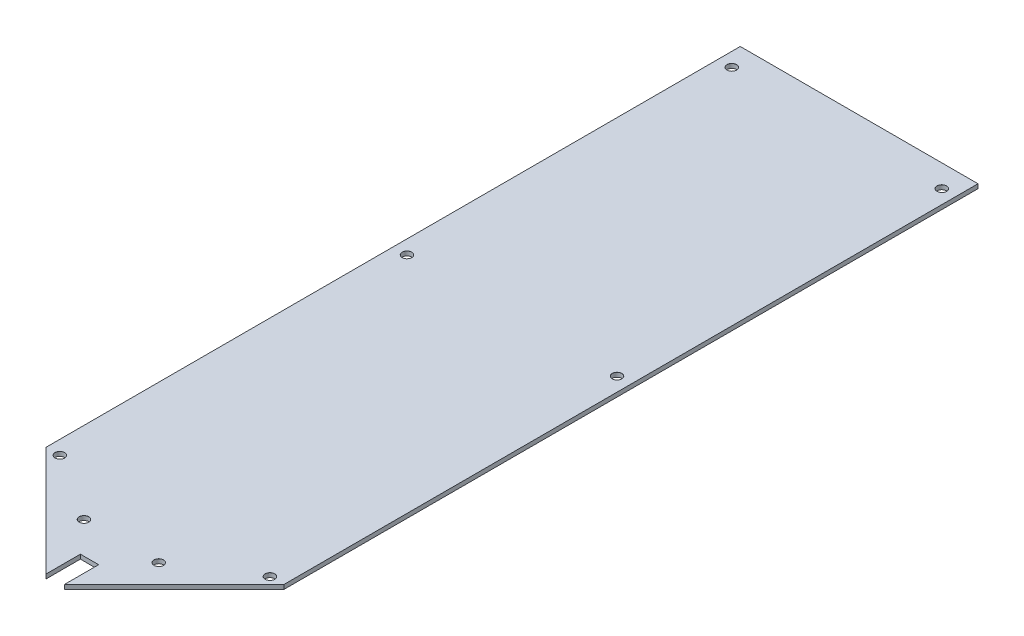
ISO-10303-21;
HEADER;
FILE_DESCRIPTION(('STEP AP214'),'2;1');
FILE_NAME('part.step','',(''),(''),'','','');
FILE_SCHEMA(('AUTOMOTIVE_DESIGN { 1 0 10303 214 1 1 1 1 }'));
ENDSEC;
DATA;
#1=APPLICATION_CONTEXT('core data for automotive mechanical design processes');
#2=APPLICATION_PROTOCOL_DEFINITION('international standard','automotive_design',2000,#1);
#3=PRODUCT_CONTEXT('',#1,'mechanical');
#4=PRODUCT('Part','Part','',(#3));
#5=PRODUCT_RELATED_PRODUCT_CATEGORY('part','',(#4));
#6=PRODUCT_DEFINITION_FORMATION('','',#4);
#7=PRODUCT_DEFINITION_CONTEXT('part definition',#1,'design');
#8=PRODUCT_DEFINITION('design','',#6,#7);
#9=PRODUCT_DEFINITION_SHAPE('','',#8);
#10=(LENGTH_UNIT() NAMED_UNIT(*) SI_UNIT(.MILLI.,.METRE.));
#11=(NAMED_UNIT(*) PLANE_ANGLE_UNIT() SI_UNIT($,.RADIAN.));
#12=(NAMED_UNIT(*) SI_UNIT($,.STERADIAN.) SOLID_ANGLE_UNIT());
#13=UNCERTAINTY_MEASURE_WITH_UNIT(LENGTH_MEASURE(1.E-05),#10,'distance_accuracy_value','');
#14=(GEOMETRIC_REPRESENTATION_CONTEXT(3) GLOBAL_UNCERTAINTY_ASSIGNED_CONTEXT((#13)) GLOBAL_UNIT_ASSIGNED_CONTEXT((#10,
#11,#12)) REPRESENTATION_CONTEXT('',''));
#15=CARTESIAN_POINT('',(0.,0.,0.));
#16=DIRECTION('',(0.,0.,1.));
#17=DIRECTION('',(1.,0.,0.));
#18=AXIS2_PLACEMENT_3D('',#15,#16,#17);
#19=CARTESIAN_POINT('',(82.7,-3.,-82.7000000000012));
#20=DIRECTION('',(1.,0.,0.));
#21=DIRECTION('',(0.,0.,-1.));
#22=AXIS2_PLACEMENT_3D('',#19,#20,#21);
#23=PLANE('',#22);
#24=DIRECTION('',(0.,0.,-1.));
#25=VECTOR('',#24,1.);
#26=CARTESIAN_POINT('',(82.7,0.,-82.7000000000012));
#27=LINE('',#26,#25);
#28=CARTESIAN_POINT('',(82.7,0.,-82.7000000000012));
#29=VERTEX_POINT('',#28);
#30=CARTESIAN_POINT('',(82.7,0.,-565.66051224));
#31=VERTEX_POINT('',#30);
#32=EDGE_CURVE('E149',#29,#31,#27,.T.);
#33=ORIENTED_EDGE('',*,*,#32,.F.);
#34=DIRECTION('',(0.,1.,0.));
#35=VECTOR('',#34,1.);
#36=CARTESIAN_POINT('',(82.7,-3.,-82.7000000000012));
#37=LINE('',#36,#35);
#38=CARTESIAN_POINT('',(82.7,-3.,-82.7000000000012));
#39=VERTEX_POINT('',#38);
#40=EDGE_CURVE('E11',#39,#29,#37,.T.);
#41=ORIENTED_EDGE('',*,*,#40,.F.);
#42=DIRECTION('',(0.,0.,-1.));
#43=VECTOR('',#42,1.);
#44=CARTESIAN_POINT('',(82.7,-3.,-82.7000000000012));
#45=LINE('',#44,#43);
#46=CARTESIAN_POINT('',(82.7,-3.,-565.66051224));
#47=VERTEX_POINT('',#46);
#48=EDGE_CURVE('E178',#39,#47,#45,.T.);
#49=ORIENTED_EDGE('',*,*,#48,.T.);
#50=DIRECTION('',(0.,1.,0.));
#51=VECTOR('',#50,1.);
#52=CARTESIAN_POINT('',(82.7,-3.,-565.66051224));
#53=LINE('',#52,#51);
#54=EDGE_CURVE('E102',#47,#31,#53,.T.);
#55=ORIENTED_EDGE('',*,*,#54,.T.);
#56=EDGE_LOOP('',(#33,#41,#49,#55));
#57=FACE_BOUND('',#56,.T.);
#58=ADVANCED_FACE('F45',(#57),#23,.T.);
#59=CARTESIAN_POINT('',(6.35,-3.,-6.35000000000009));
#60=DIRECTION('',(0.707106781186553,0.,0.707106781186542));
#61=DIRECTION('',(0.707106781186542,0.,-0.707106781186553));
#62=AXIS2_PLACEMENT_3D('',#59,#60,#61);
#63=PLANE('',#62);
#64=DIRECTION('',(0.707106781186543,0.,-0.707106781186553));
#65=VECTOR('',#64,1.);
#66=CARTESIAN_POINT('',(6.35,0.,-6.35000000000009));
#67=LINE('',#66,#65);
#68=CARTESIAN_POINT('',(6.35,0.,-6.35000000000009));
#69=VERTEX_POINT('',#68);
#70=EDGE_CURVE('E175',#69,#29,#67,.T.);
#71=ORIENTED_EDGE('',*,*,#70,.F.);
#72=DIRECTION('',(0.,1.,0.));
#73=VECTOR('',#72,1.);
#74=CARTESIAN_POINT('',(6.35,-3.,-6.35000000000009));
#75=LINE('',#74,#73);
#76=CARTESIAN_POINT('',(6.35,-3.,-6.35000000000009));
#77=VERTEX_POINT('',#76);
#78=EDGE_CURVE('E55',#77,#69,#75,.T.);
#79=ORIENTED_EDGE('',*,*,#78,.F.);
#80=DIRECTION('',(0.707106781186543,0.,-0.707106781186553));
#81=VECTOR('',#80,1.);
#82=CARTESIAN_POINT('',(6.35,-3.,-6.35000000000009));
#83=LINE('',#82,#81);
#84=EDGE_CURVE('E135',#77,#39,#83,.T.);
#85=ORIENTED_EDGE('',*,*,#84,.T.);
#86=ORIENTED_EDGE('',*,*,#40,.T.);
#87=EDGE_LOOP('',(#71,#79,#85,#86));
#88=FACE_BOUND('',#87,.T.);
#89=ADVANCED_FACE('F304',(#88),#63,.T.);
#90=CARTESIAN_POINT('',(6.35,-3.,-30.27243444));
#91=DIRECTION('',(-1.,0.,0.));
#92=DIRECTION('',(0.,0.,1.));
#93=AXIS2_PLACEMENT_3D('',#90,#91,#92);
#94=PLANE('',#93);
#95=DIRECTION('',(0.,0.,1.));
#96=VECTOR('',#95,1.);
#97=CARTESIAN_POINT('',(6.35,0.,-30.27243444));
#98=LINE('',#97,#96);
#99=CARTESIAN_POINT('',(6.35,0.,-30.27243444));
#100=VERTEX_POINT('',#99);
#101=EDGE_CURVE('E121',#100,#69,#98,.T.);
#102=ORIENTED_EDGE('',*,*,#101,.F.);
#103=DIRECTION('',(0.,1.,0.));
#104=VECTOR('',#103,1.);
#105=CARTESIAN_POINT('',(6.35,-3.,-30.27243444));
#106=LINE('',#105,#104);
#107=CARTESIAN_POINT('',(6.35,-3.,-30.27243444));
#108=VERTEX_POINT('',#107);
#109=EDGE_CURVE('E116',#108,#100,#106,.T.);
#110=ORIENTED_EDGE('',*,*,#109,.F.);
#111=DIRECTION('',(0.,0.,1.));
#112=VECTOR('',#111,1.);
#113=CARTESIAN_POINT('',(6.35,-3.,-30.27243444));
#114=LINE('',#113,#112);
#115=EDGE_CURVE('E119',#108,#77,#114,.T.);
#116=ORIENTED_EDGE('',*,*,#115,.T.);
#117=ORIENTED_EDGE('',*,*,#78,.T.);
#118=EDGE_LOOP('',(#102,#110,#116,#117));
#119=FACE_BOUND('',#118,.T.);
#120=ADVANCED_FACE('F118',(#119),#94,.T.);
#121=CARTESIAN_POINT('',(-6.35000000000002,-3.,-30.27243444));
#122=DIRECTION('',(0.,0.,1.));
#123=DIRECTION('',(1.,0.,0.));
#124=AXIS2_PLACEMENT_3D('',#121,#122,#123);
#125=PLANE('',#124);
#126=DIRECTION('',(1.,0.,0.));
#127=VECTOR('',#126,1.);
#128=CARTESIAN_POINT('',(-6.35000000000002,0.,-30.27243444));
#129=LINE('',#128,#127);
#130=CARTESIAN_POINT('',(-6.35000000000002,0.,-30.27243444));
#131=VERTEX_POINT('',#130);
#132=EDGE_CURVE('E170',#131,#100,#129,.T.);
#133=ORIENTED_EDGE('',*,*,#132,.F.);
#134=DIRECTION('',(0.,1.,0.));
#135=VECTOR('',#134,1.);
#136=CARTESIAN_POINT('',(-6.35000000000002,-3.,-30.27243444));
#137=LINE('',#136,#135);
#138=CARTESIAN_POINT('',(-6.35000000000002,-3.,-30.27243444));
#139=VERTEX_POINT('',#138);
#140=EDGE_CURVE('E127',#139,#131,#137,.T.);
#141=ORIENTED_EDGE('',*,*,#140,.F.);
#142=DIRECTION('',(1.,0.,0.));
#143=VECTOR('',#142,1.);
#144=CARTESIAN_POINT('',(-6.35000000000002,-3.,-30.27243444));
#145=LINE('',#144,#143);
#146=EDGE_CURVE('E133',#139,#108,#145,.T.);
#147=ORIENTED_EDGE('',*,*,#146,.T.);
#148=ORIENTED_EDGE('',*,*,#109,.T.);
#149=EDGE_LOOP('',(#133,#141,#147,#148));
#150=FACE_BOUND('',#149,.T.);
#151=ADVANCED_FACE('F138',(#150),#125,.T.);
#152=CARTESIAN_POINT('',(-6.35000000000002,-3.,-30.27243444));
#153=DIRECTION('',(1.,0.,0.));
#154=DIRECTION('',(0.,0.,-1.));
#155=AXIS2_PLACEMENT_3D('',#152,#153,#154);
#156=PLANE('',#155);
#157=DIRECTION('',(0.,0.,-1.));
#158=VECTOR('',#157,1.);
#159=CARTESIAN_POINT('',(-6.35000000000002,0.,-30.27243444));
#160=LINE('',#159,#158);
#161=CARTESIAN_POINT('',(-6.35000000000001,0.,-6.35000000000009));
#162=VERTEX_POINT('',#161);
#163=EDGE_CURVE('E166',#162,#131,#160,.T.);
#164=ORIENTED_EDGE('',*,*,#163,.F.);
#165=DIRECTION('',(0.,1.,0.));
#166=VECTOR('',#165,1.);
#167=CARTESIAN_POINT('',(-6.35000000000001,-3.,-6.35000000000009));
#168=LINE('',#167,#166);
#169=CARTESIAN_POINT('',(-6.35000000000001,-3.,-6.35000000000009));
#170=VERTEX_POINT('',#169);
#171=EDGE_CURVE('E184',#170,#162,#168,.T.);
#172=ORIENTED_EDGE('',*,*,#171,.F.);
#173=DIRECTION('',(0.,0.,-1.));
#174=VECTOR('',#173,1.);
#175=CARTESIAN_POINT('',(-6.35000000000002,-3.,-30.27243444));
#176=LINE('',#175,#174);
#177=EDGE_CURVE('E140',#170,#139,#176,.T.);
#178=ORIENTED_EDGE('',*,*,#177,.T.);
#179=ORIENTED_EDGE('',*,*,#140,.T.);
#180=EDGE_LOOP('',(#164,#172,#178,#179));
#181=FACE_BOUND('',#180,.T.);
#182=ADVANCED_FACE('F317',(#181),#156,.T.);
#183=CARTESIAN_POINT('',(-6.35000000000001,-3.,-6.35000000000009));
#184=DIRECTION('',(-0.707106781186553,0.,0.707106781186542));
#185=DIRECTION('',(0.707106781186542,0.,0.707106781186553));
#186=AXIS2_PLACEMENT_3D('',#183,#184,#185);
#187=PLANE('',#186);
#188=DIRECTION('',(0.707106781186542,0.,0.707106781186553));
#189=VECTOR('',#188,1.);
#190=CARTESIAN_POINT('',(-6.35000000000001,0.,-6.35000000000009));
#191=LINE('',#190,#189);
#192=CARTESIAN_POINT('',(-82.7,0.,-82.7000000000012));
#193=VERTEX_POINT('',#192);
#194=EDGE_CURVE('E162',#193,#162,#191,.T.);
#195=ORIENTED_EDGE('',*,*,#194,.F.);
#196=DIRECTION('',(0.,1.,0.));
#197=VECTOR('',#196,1.);
#198=CARTESIAN_POINT('',(-82.7,-3.,-82.7000000000012));
#199=LINE('',#198,#197);
#200=CARTESIAN_POINT('',(-82.7,-3.,-82.7000000000012));
#201=VERTEX_POINT('',#200);
#202=EDGE_CURVE('E187',#201,#193,#199,.T.);
#203=ORIENTED_EDGE('',*,*,#202,.F.);
#204=DIRECTION('',(0.707106781186542,0.,0.707106781186553));
#205=VECTOR('',#204,1.);
#206=CARTESIAN_POINT('',(-6.35000000000001,-3.,-6.35000000000009));
#207=LINE('',#206,#205);
#208=EDGE_CURVE('E143',#201,#170,#207,.T.);
#209=ORIENTED_EDGE('',*,*,#208,.T.);
#210=ORIENTED_EDGE('',*,*,#171,.T.);
#211=EDGE_LOOP('',(#195,#203,#209,#210));
#212=FACE_BOUND('',#211,.T.);
#213=ADVANCED_FACE('F295',(#212),#187,.T.);
#214=CARTESIAN_POINT('',(-82.7,-3.,-82.7000000000012));
#215=DIRECTION('',(-1.,0.,0.));
#216=DIRECTION('',(0.,0.,1.));
#217=AXIS2_PLACEMENT_3D('',#214,#215,#216);
#218=PLANE('',#217);
#219=DIRECTION('',(0.,0.,1.));
#220=VECTOR('',#219,1.);
#221=CARTESIAN_POINT('',(-82.7,0.,-82.7000000000012));
#222=LINE('',#221,#220);
#223=CARTESIAN_POINT('',(-82.7,0.,-565.66051224));
#224=VERTEX_POINT('',#223);
#225=EDGE_CURVE('E158',#224,#193,#222,.T.);
#226=ORIENTED_EDGE('',*,*,#225,.F.);
#227=DIRECTION('',(0.,1.,0.));
#228=VECTOR('',#227,1.);
#229=CARTESIAN_POINT('',(-82.7,-3.,-565.66051224));
#230=LINE('',#229,#228);
#231=CARTESIAN_POINT('',(-82.7,-3.,-565.66051224));
#232=VERTEX_POINT('',#231);
#233=EDGE_CURVE('E190',#232,#224,#230,.T.);
#234=ORIENTED_EDGE('',*,*,#233,.F.);
#235=DIRECTION('',(0.,0.,1.));
#236=VECTOR('',#235,1.);
#237=CARTESIAN_POINT('',(-82.7,-3.,-82.7000000000012));
#238=LINE('',#237,#236);
#239=EDGE_CURVE('E287',#232,#201,#238,.T.);
#240=ORIENTED_EDGE('',*,*,#239,.T.);
#241=ORIENTED_EDGE('',*,*,#202,.T.);
#242=EDGE_LOOP('',(#226,#234,#240,#241));
#243=FACE_BOUND('',#242,.T.);
#244=ADVANCED_FACE('F300',(#243),#218,.T.);
#245=CARTESIAN_POINT('',(-82.7,-3.,-565.66051224));
#246=DIRECTION('',(0.,0.,-1.));
#247=DIRECTION('',(-1.,0.,0.));
#248=AXIS2_PLACEMENT_3D('',#245,#246,#247);
#249=PLANE('',#248);
#250=DIRECTION('',(-1.,0.,0.));
#251=VECTOR('',#250,1.);
#252=CARTESIAN_POINT('',(-82.7,0.,-565.66051224));
#253=LINE('',#252,#251);
#254=EDGE_CURVE('E153',#31,#224,#253,.T.);
#255=ORIENTED_EDGE('',*,*,#254,.F.);
#256=ORIENTED_EDGE('',*,*,#54,.F.);
#257=DIRECTION('',(-1.,0.,0.));
#258=VECTOR('',#257,1.);
#259=CARTESIAN_POINT('',(-82.7,-3.,-565.66051224));
#260=LINE('',#259,#258);
#261=EDGE_CURVE('E284',#47,#232,#260,.T.);
#262=ORIENTED_EDGE('',*,*,#261,.T.);
#263=ORIENTED_EDGE('',*,*,#233,.T.);
#264=EDGE_LOOP('',(#255,#256,#262,#263));
#265=FACE_BOUND('',#264,.T.);
#266=ADVANCED_FACE('F301',(#265),#249,.T.);
#267=CARTESIAN_POINT('',(0.,-3.,0.));
#268=DIRECTION('',(0.,-1.,0.));
#269=DIRECTION('',(0.,0.,-1.));
#270=AXIS2_PLACEMENT_3D('',#267,#268,#269);
#271=PLANE('',#270);
#272=CARTESIAN_POINT('',(-73.056682922361,-3.,-550.131268360368));
#273=DIRECTION('',(0.,-1.,0.));
#274=DIRECTION('',(0.,0.,-1.));
#275=AXIS2_PLACEMENT_3D('',#272,#273,#274);
#276=CIRCLE('',#275,3.3);
#277=CARTESIAN_POINT('',(-73.056682922361,-3.,-553.431268360368));
#278=VERTEX_POINT('',#277);
#279=EDGE_CURVE('E48',#278,#278,#276,.T.);
#280=ORIENTED_EDGE('',*,*,#279,.F.);
#281=EDGE_LOOP('',(#280));
#282=FACE_BOUND('',#281,.T.);
#283=CARTESIAN_POINT('',(73.056682922361,-3.,-550.131268360368));
#284=DIRECTION('',(0.,-1.,0.));
#285=DIRECTION('',(0.,0.,-1.));
#286=AXIS2_PLACEMENT_3D('',#283,#284,#285);
#287=CIRCLE('',#286,3.3);
#288=CARTESIAN_POINT('',(73.056682922361,-3.,-553.431268360368));
#289=VERTEX_POINT('',#288);
#290=EDGE_CURVE('E228',#289,#289,#287,.T.);
#291=ORIENTED_EDGE('',*,*,#290,.F.);
#292=EDGE_LOOP('',(#291));
#293=FACE_BOUND('',#292,.T.);
#294=CARTESIAN_POINT('',(-73.056682922361,-3.,-324.180256120001));
#295=DIRECTION('',(0.,-1.,0.));
#296=DIRECTION('',(0.,0.,-1.));
#297=AXIS2_PLACEMENT_3D('',#294,#295,#296);
#298=CIRCLE('',#297,3.3);
#299=CARTESIAN_POINT('',(-73.056682922361,-3.,-327.480256120001));
#300=VERTEX_POINT('',#299);
#301=EDGE_CURVE('E223',#300,#300,#298,.T.);
#302=ORIENTED_EDGE('',*,*,#301,.F.);
#303=EDGE_LOOP('',(#302));
#304=FACE_BOUND('',#303,.T.);
#305=CARTESIAN_POINT('',(73.0566829223611,-3.,-324.180256120001));
#306=DIRECTION('',(0.,-1.,0.));
#307=DIRECTION('',(0.,0.,-1.));
#308=AXIS2_PLACEMENT_3D('',#305,#306,#307);
#309=CIRCLE('',#308,3.3);
#310=CARTESIAN_POINT('',(73.0566829223611,-3.,-327.480256120001));
#311=VERTEX_POINT('',#310);
#312=EDGE_CURVE('E217',#311,#311,#309,.T.);
#313=ORIENTED_EDGE('',*,*,#312,.F.);
#314=EDGE_LOOP('',(#313));
#315=FACE_BOUND('',#314,.T.);
#316=CARTESIAN_POINT('',(73.0566829223611,-3.,-82.7000000000012));
#317=DIRECTION('',(0.,-1.,0.));
#318=DIRECTION('',(0.,0.,-1.));
#319=AXIS2_PLACEMENT_3D('',#316,#317,#318);
#320=CIRCLE('',#319,3.3);
#321=CARTESIAN_POINT('',(73.0566829223611,-3.,-86.0000000000012));
#322=VERTEX_POINT('',#321);
#323=EDGE_CURVE('E211',#322,#322,#320,.T.);
#324=ORIENTED_EDGE('',*,*,#323,.F.);
#325=EDGE_LOOP('',(#324));
#326=FACE_BOUND('',#325,.T.);
#327=CARTESIAN_POINT('',(-73.056682922361,-3.,-82.7000000000012));
#328=DIRECTION('',(0.,-1.,0.));
#329=DIRECTION('',(0.,0.,-1.));
#330=AXIS2_PLACEMENT_3D('',#327,#328,#329);
#331=CIRCLE('',#330,3.3);
#332=CARTESIAN_POINT('',(-73.056682922361,-3.,-86.0000000000012));
#333=VERTEX_POINT('',#332);
#334=EDGE_CURVE('E205',#333,#333,#331,.T.);
#335=ORIENTED_EDGE('',*,*,#334,.F.);
#336=EDGE_LOOP('',(#335));
#337=FACE_BOUND('',#336,.T.);
#338=CARTESIAN_POINT('',(-26.0149142377893,-3.,-52.4348316314886));
#339=DIRECTION('',(0.,-1.,0.));
#340=DIRECTION('',(0.,0.,-1.));
#341=AXIS2_PLACEMENT_3D('',#338,#339,#340);
#342=CIRCLE('',#341,3.3);
#343=CARTESIAN_POINT('',(-26.0149142377893,-3.,-55.7348316314886));
#344=VERTEX_POINT('',#343);
#345=EDGE_CURVE('E199',#344,#344,#342,.T.);
#346=ORIENTED_EDGE('',*,*,#345,.F.);
#347=EDGE_LOOP('',(#346));
#348=FACE_BOUND('',#347,.T.);
#349=CARTESIAN_POINT('',(26.0149142377894,-3.,-52.4348316314887));
#350=DIRECTION('',(0.,-1.,0.));
#351=DIRECTION('',(0.,0.,-1.));
#352=AXIS2_PLACEMENT_3D('',#349,#350,#351);
#353=CIRCLE('',#352,3.3);
#354=CARTESIAN_POINT('',(26.0149142377894,-3.,-55.7348316314887));
#355=VERTEX_POINT('',#354);
#356=EDGE_CURVE('E154',#355,#355,#353,.T.);
#357=ORIENTED_EDGE('',*,*,#356,.F.);
#358=EDGE_LOOP('',(#357));
#359=FACE_BOUND('',#358,.T.);
#360=ORIENTED_EDGE('',*,*,#48,.F.);
#361=ORIENTED_EDGE('',*,*,#84,.F.);
#362=ORIENTED_EDGE('',*,*,#115,.F.);
#363=ORIENTED_EDGE('',*,*,#146,.F.);
#364=ORIENTED_EDGE('',*,*,#177,.F.);
#365=ORIENTED_EDGE('',*,*,#208,.F.);
#366=ORIENTED_EDGE('',*,*,#239,.F.);
#367=ORIENTED_EDGE('',*,*,#261,.F.);
#368=EDGE_LOOP('',(#360,#361,#362,#363,#364,#365,#366,#367));
#369=FACE_BOUND('',#368,.T.);
#370=ADVANCED_FACE('F131',(#282,#293,#304,#315,#326,#337,#348,#359,#369),#271,.T.);
#371=CARTESIAN_POINT('',(0.,0.,0.));
#372=DIRECTION('',(0.,-1.,0.));
#373=DIRECTION('',(0.,0.,-1.));
#374=AXIS2_PLACEMENT_3D('',#371,#372,#373);
#375=PLANE('',#374);
#376=CARTESIAN_POINT('',(-73.056682922361,0.,-550.131268360368));
#377=DIRECTION('',(0.,1.,0.));
#378=DIRECTION('',(0.,0.,1.));
#379=AXIS2_PLACEMENT_3D('',#376,#377,#378);
#380=CIRCLE('',#379,3.32499999999999);
#381=CARTESIAN_POINT('',(-73.056682922361,0.,-546.806268360368));
#382=VERTEX_POINT('',#381);
#383=EDGE_CURVE('E406',#382,#382,#380,.T.);
#384=ORIENTED_EDGE('',*,*,#383,.F.);
#385=EDGE_LOOP('',(#384));
#386=FACE_BOUND('',#385,.T.);
#387=CARTESIAN_POINT('',(73.056682922361,0.,-550.131268360368));
#388=DIRECTION('',(0.,1.,0.));
#389=DIRECTION('',(0.,0.,1.));
#390=AXIS2_PLACEMENT_3D('',#387,#388,#389);
#391=CIRCLE('',#390,3.32499999999999);
#392=CARTESIAN_POINT('',(73.056682922361,0.,-546.806268360368));
#393=VERTEX_POINT('',#392);
#394=EDGE_CURVE('E240',#393,#393,#391,.T.);
#395=ORIENTED_EDGE('',*,*,#394,.F.);
#396=EDGE_LOOP('',(#395));
#397=FACE_BOUND('',#396,.T.);
#398=CARTESIAN_POINT('',(-73.056682922361,0.,-324.180256120001));
#399=DIRECTION('',(0.,1.,0.));
#400=DIRECTION('',(0.,0.,1.));
#401=AXIS2_PLACEMENT_3D('',#398,#399,#400);
#402=CIRCLE('',#401,3.32499999999999);
#403=CARTESIAN_POINT('',(-73.056682922361,0.,-320.855256120001));
#404=VERTEX_POINT('',#403);
#405=EDGE_CURVE('E231',#404,#404,#402,.T.);
#406=ORIENTED_EDGE('',*,*,#405,.F.);
#407=EDGE_LOOP('',(#406));
#408=FACE_BOUND('',#407,.T.);
#409=CARTESIAN_POINT('',(73.0566829223611,0.,-324.180256120001));
#410=DIRECTION('',(0.,1.,0.));
#411=DIRECTION('',(0.,0.,1.));
#412=AXIS2_PLACEMENT_3D('',#409,#410,#411);
#413=CIRCLE('',#412,3.32499999999999);
#414=CARTESIAN_POINT('',(73.0566829223611,0.,-320.855256120001));
#415=VERTEX_POINT('',#414);
#416=EDGE_CURVE('E226',#415,#415,#413,.T.);
#417=ORIENTED_EDGE('',*,*,#416,.F.);
#418=EDGE_LOOP('',(#417));
#419=FACE_BOUND('',#418,.T.);
#420=CARTESIAN_POINT('',(73.0566829223611,0.,-82.7000000000012));
#421=DIRECTION('',(0.,1.,0.));
#422=DIRECTION('',(0.,0.,1.));
#423=AXIS2_PLACEMENT_3D('',#420,#421,#422);
#424=CIRCLE('',#423,3.32499999999999);
#425=CARTESIAN_POINT('',(73.0566829223611,0.,-79.3750000000012));
#426=VERTEX_POINT('',#425);
#427=EDGE_CURVE('E221',#426,#426,#424,.T.);
#428=ORIENTED_EDGE('',*,*,#427,.F.);
#429=EDGE_LOOP('',(#428));
#430=FACE_BOUND('',#429,.T.);
#431=CARTESIAN_POINT('',(-73.056682922361,0.,-82.7000000000012));
#432=DIRECTION('',(0.,1.,0.));
#433=DIRECTION('',(0.,0.,1.));
#434=AXIS2_PLACEMENT_3D('',#431,#432,#433);
#435=CIRCLE('',#434,3.32499999999999);
#436=CARTESIAN_POINT('',(-73.056682922361,0.,-79.3750000000012));
#437=VERTEX_POINT('',#436);
#438=EDGE_CURVE('E215',#437,#437,#435,.T.);
#439=ORIENTED_EDGE('',*,*,#438,.F.);
#440=EDGE_LOOP('',(#439));
#441=FACE_BOUND('',#440,.T.);
#442=CARTESIAN_POINT('',(-26.0149142377893,0.,-52.4348316314886));
#443=DIRECTION('',(0.,1.,0.));
#444=DIRECTION('',(0.,0.,1.));
#445=AXIS2_PLACEMENT_3D('',#442,#443,#444);
#446=CIRCLE('',#445,3.325);
#447=CARTESIAN_POINT('',(-26.0149142377893,0.,-49.1098316314886));
#448=VERTEX_POINT('',#447);
#449=EDGE_CURVE('E209',#448,#448,#446,.T.);
#450=ORIENTED_EDGE('',*,*,#449,.F.);
#451=EDGE_LOOP('',(#450));
#452=FACE_BOUND('',#451,.T.);
#453=CARTESIAN_POINT('',(26.0149142377894,0.,-52.4348316314887));
#454=DIRECTION('',(0.,1.,0.));
#455=DIRECTION('',(0.,0.,1.));
#456=AXIS2_PLACEMENT_3D('',#453,#454,#455);
#457=CIRCLE('',#456,3.325);
#458=CARTESIAN_POINT('',(26.0149142377894,0.,-49.1098316314887));
#459=VERTEX_POINT('',#458);
#460=EDGE_CURVE('E203',#459,#459,#457,.T.);
#461=ORIENTED_EDGE('',*,*,#460,.F.);
#462=EDGE_LOOP('',(#461));
#463=FACE_BOUND('',#462,.T.);
#464=ORIENTED_EDGE('',*,*,#32,.T.);
#465=ORIENTED_EDGE('',*,*,#254,.T.);
#466=ORIENTED_EDGE('',*,*,#225,.T.);
#467=ORIENTED_EDGE('',*,*,#194,.T.);
#468=ORIENTED_EDGE('',*,*,#163,.T.);
#469=ORIENTED_EDGE('',*,*,#132,.T.);
#470=ORIENTED_EDGE('',*,*,#101,.T.);
#471=ORIENTED_EDGE('',*,*,#70,.T.);
#472=EDGE_LOOP('',(#464,#465,#466,#467,#468,#469,#470,#471));
#473=FACE_BOUND('',#472,.T.);
#474=ADVANCED_FACE('F303',(#386,#397,#408,#419,#430,#441,#452,#463,#473),#375,.F.);
#475=CARTESIAN_POINT('',(26.0149142377894,0.,-52.4348316314887));
#476=DIRECTION('',(0.,1.,0.));
#477=DIRECTION('',(0.,0.,1.));
#478=AXIS2_PLACEMENT_3D('',#475,#476,#477);
#479=CYLINDRICAL_SURFACE('',#478,3.3);
#480=ORIENTED_EDGE('',*,*,#356,.T.);
#481=EDGE_LOOP('',(#480));
#482=FACE_BOUND('',#481,.T.);
#483=CARTESIAN_POINT('',(26.0149142377894,-0.0250000000000007,-52.4348316314887));
#484=DIRECTION('',(0.,1.,0.));
#485=DIRECTION('',(0.,0.,1.));
#486=AXIS2_PLACEMENT_3D('',#483,#484,#485);
#487=CIRCLE('',#486,3.3);
#488=CARTESIAN_POINT('',(26.0149142377894,-0.0250000000000007,-49.1348316314887));
#489=VERTEX_POINT('',#488);
#490=EDGE_CURVE('E198',#489,#489,#487,.T.);
#491=ORIENTED_EDGE('',*,*,#490,.T.);
#492=EDGE_LOOP('',(#491));
#493=FACE_BOUND('',#492,.T.);
#494=ADVANCED_FACE('F332',(#482,#493),#479,.F.);
#495=CARTESIAN_POINT('',(26.0149142377894,0.,-52.4348316314887));
#496=DIRECTION('',(0.,1.,0.));
#497=DIRECTION('',(0.,0.,1.));
#498=AXIS2_PLACEMENT_3D('',#495,#496,#497);
#499=CONICAL_SURFACE('',#498,3.325,0.785398163397518);
#500=ORIENTED_EDGE('',*,*,#490,.F.);
#501=EDGE_LOOP('',(#500));
#502=FACE_BOUND('',#501,.T.);
#503=ORIENTED_EDGE('',*,*,#460,.T.);
#504=EDGE_LOOP('',(#503));
#505=FACE_BOUND('',#504,.T.);
#506=ADVANCED_FACE('F339',(#502,#505),#499,.F.);
#507=CARTESIAN_POINT('',(-26.0149142377893,0.,-52.4348316314886));
#508=DIRECTION('',(0.,1.,0.));
#509=DIRECTION('',(0.,0.,1.));
#510=AXIS2_PLACEMENT_3D('',#507,#508,#509);
#511=CYLINDRICAL_SURFACE('',#510,3.3);
#512=ORIENTED_EDGE('',*,*,#345,.T.);
#513=EDGE_LOOP('',(#512));
#514=FACE_BOUND('',#513,.T.);
#515=CARTESIAN_POINT('',(-26.0149142377893,-0.0250000000000007,-52.4348316314886));
#516=DIRECTION('',(0.,1.,0.));
#517=DIRECTION('',(0.,0.,1.));
#518=AXIS2_PLACEMENT_3D('',#515,#516,#517);
#519=CIRCLE('',#518,3.3);
#520=CARTESIAN_POINT('',(-26.0149142377893,-0.0250000000000007,-49.1348316314887));
#521=VERTEX_POINT('',#520);
#522=EDGE_CURVE('E204',#521,#521,#519,.T.);
#523=ORIENTED_EDGE('',*,*,#522,.T.);
#524=EDGE_LOOP('',(#523));
#525=FACE_BOUND('',#524,.T.);
#526=ADVANCED_FACE('F343',(#514,#525),#511,.F.);
#527=CARTESIAN_POINT('',(-26.0149142377893,0.,-52.4348316314886));
#528=DIRECTION('',(0.,1.,0.));
#529=DIRECTION('',(0.,0.,1.));
#530=AXIS2_PLACEMENT_3D('',#527,#528,#529);
#531=CONICAL_SURFACE('',#530,3.325,0.785398163397518);
#532=ORIENTED_EDGE('',*,*,#522,.F.);
#533=EDGE_LOOP('',(#532));
#534=FACE_BOUND('',#533,.T.);
#535=ORIENTED_EDGE('',*,*,#449,.T.);
#536=EDGE_LOOP('',(#535));
#537=FACE_BOUND('',#536,.T.);
#538=ADVANCED_FACE('F347',(#534,#537),#531,.F.);
#539=CARTESIAN_POINT('',(-73.056682922361,0.,-82.7000000000012));
#540=DIRECTION('',(0.,1.,0.));
#541=DIRECTION('',(0.,0.,1.));
#542=AXIS2_PLACEMENT_3D('',#539,#540,#541);
#543=CYLINDRICAL_SURFACE('',#542,3.3);
#544=ORIENTED_EDGE('',*,*,#334,.T.);
#545=EDGE_LOOP('',(#544));
#546=FACE_BOUND('',#545,.T.);
#547=CARTESIAN_POINT('',(-73.056682922361,-0.0250000000000007,-82.7000000000012));
#548=DIRECTION('',(0.,1.,0.));
#549=DIRECTION('',(0.,0.,1.));
#550=AXIS2_PLACEMENT_3D('',#547,#548,#549);
#551=CIRCLE('',#550,3.3);
#552=CARTESIAN_POINT('',(-73.056682922361,-0.0250000000000007,-79.4000000000012));
#553=VERTEX_POINT('',#552);
#554=EDGE_CURVE('E210',#553,#553,#551,.T.);
#555=ORIENTED_EDGE('',*,*,#554,.T.);
#556=EDGE_LOOP('',(#555));
#557=FACE_BOUND('',#556,.T.);
#558=ADVANCED_FACE('F351',(#546,#557),#543,.F.);
#559=CARTESIAN_POINT('',(-73.056682922361,0.,-82.7000000000012));
#560=DIRECTION('',(0.,1.,0.));
#561=DIRECTION('',(0.,0.,1.));
#562=AXIS2_PLACEMENT_3D('',#559,#560,#561);
#563=CONICAL_SURFACE('',#562,3.32499999999999,0.785398163397379);
#564=ORIENTED_EDGE('',*,*,#554,.F.);
#565=EDGE_LOOP('',(#564));
#566=FACE_BOUND('',#565,.T.);
#567=ORIENTED_EDGE('',*,*,#438,.T.);
#568=EDGE_LOOP('',(#567));
#569=FACE_BOUND('',#568,.T.);
#570=ADVANCED_FACE('F355',(#566,#569),#563,.F.);
#571=CARTESIAN_POINT('',(73.0566829223611,0.,-82.7000000000012));
#572=DIRECTION('',(0.,1.,0.));
#573=DIRECTION('',(0.,0.,1.));
#574=AXIS2_PLACEMENT_3D('',#571,#572,#573);
#575=CYLINDRICAL_SURFACE('',#574,3.3);
#576=ORIENTED_EDGE('',*,*,#323,.T.);
#577=EDGE_LOOP('',(#576));
#578=FACE_BOUND('',#577,.T.);
#579=CARTESIAN_POINT('',(73.0566829223611,-0.0250000000000007,-82.7000000000012));
#580=DIRECTION('',(0.,1.,0.));
#581=DIRECTION('',(0.,0.,1.));
#582=AXIS2_PLACEMENT_3D('',#579,#580,#581);
#583=CIRCLE('',#582,3.3);
#584=CARTESIAN_POINT('',(73.0566829223611,-0.0250000000000007,-79.4000000000012));
#585=VERTEX_POINT('',#584);
#586=EDGE_CURVE('E216',#585,#585,#583,.T.);
#587=ORIENTED_EDGE('',*,*,#586,.T.);
#588=EDGE_LOOP('',(#587));
#589=FACE_BOUND('',#588,.T.);
#590=ADVANCED_FACE('F359',(#578,#589),#575,.F.);
#591=CARTESIAN_POINT('',(73.0566829223611,0.,-82.7000000000012));
#592=DIRECTION('',(0.,1.,0.));
#593=DIRECTION('',(0.,0.,1.));
#594=AXIS2_PLACEMENT_3D('',#591,#592,#593);
#595=CONICAL_SURFACE('',#594,3.32499999999999,0.785398163397379);
#596=ORIENTED_EDGE('',*,*,#586,.F.);
#597=EDGE_LOOP('',(#596));
#598=FACE_BOUND('',#597,.T.);
#599=ORIENTED_EDGE('',*,*,#427,.T.);
#600=EDGE_LOOP('',(#599));
#601=FACE_BOUND('',#600,.T.);
#602=ADVANCED_FACE('F363',(#598,#601),#595,.F.);
#603=CARTESIAN_POINT('',(73.0566829223611,0.,-324.180256120001));
#604=DIRECTION('',(0.,1.,0.));
#605=DIRECTION('',(0.,0.,1.));
#606=AXIS2_PLACEMENT_3D('',#603,#604,#605);
#607=CYLINDRICAL_SURFACE('',#606,3.3);
#608=ORIENTED_EDGE('',*,*,#312,.T.);
#609=EDGE_LOOP('',(#608));
#610=FACE_BOUND('',#609,.T.);
#611=CARTESIAN_POINT('',(73.0566829223611,-0.0250000000000007,-324.180256120001));
#612=DIRECTION('',(0.,1.,0.));
#613=DIRECTION('',(0.,0.,1.));
#614=AXIS2_PLACEMENT_3D('',#611,#612,#613);
#615=CIRCLE('',#614,3.3);
#616=CARTESIAN_POINT('',(73.0566829223611,-0.0250000000000007,-320.880256120001));
#617=VERTEX_POINT('',#616);
#618=EDGE_CURVE('E222',#617,#617,#615,.T.);
#619=ORIENTED_EDGE('',*,*,#618,.T.);
#620=EDGE_LOOP('',(#619));
#621=FACE_BOUND('',#620,.T.);
#622=ADVANCED_FACE('F367',(#610,#621),#607,.F.);
#623=CARTESIAN_POINT('',(73.0566829223611,0.,-324.180256120001));
#624=DIRECTION('',(0.,1.,0.));
#625=DIRECTION('',(0.,0.,1.));
#626=AXIS2_PLACEMENT_3D('',#623,#624,#625);
#627=CONICAL_SURFACE('',#626,3.32499999999999,0.785398163397379);
#628=ORIENTED_EDGE('',*,*,#618,.F.);
#629=EDGE_LOOP('',(#628));
#630=FACE_BOUND('',#629,.T.);
#631=ORIENTED_EDGE('',*,*,#416,.T.);
#632=EDGE_LOOP('',(#631));
#633=FACE_BOUND('',#632,.T.);
#634=ADVANCED_FACE('F371',(#630,#633),#627,.F.);
#635=CARTESIAN_POINT('',(-73.056682922361,0.,-324.180256120001));
#636=DIRECTION('',(0.,1.,0.));
#637=DIRECTION('',(0.,0.,1.));
#638=AXIS2_PLACEMENT_3D('',#635,#636,#637);
#639=CYLINDRICAL_SURFACE('',#638,3.3);
#640=ORIENTED_EDGE('',*,*,#301,.T.);
#641=EDGE_LOOP('',(#640));
#642=FACE_BOUND('',#641,.T.);
#643=CARTESIAN_POINT('',(-73.056682922361,-0.0250000000000007,-324.180256120001));
#644=DIRECTION('',(0.,1.,0.));
#645=DIRECTION('',(0.,0.,1.));
#646=AXIS2_PLACEMENT_3D('',#643,#644,#645);
#647=CIRCLE('',#646,3.3);
#648=CARTESIAN_POINT('',(-73.056682922361,-0.0250000000000007,-320.880256120001));
#649=VERTEX_POINT('',#648);
#650=EDGE_CURVE('E227',#649,#649,#647,.T.);
#651=ORIENTED_EDGE('',*,*,#650,.T.);
#652=EDGE_LOOP('',(#651));
#653=FACE_BOUND('',#652,.T.);
#654=ADVANCED_FACE('F375',(#642,#653),#639,.F.);
#655=CARTESIAN_POINT('',(-73.056682922361,0.,-324.180256120001));
#656=DIRECTION('',(0.,1.,0.));
#657=DIRECTION('',(0.,0.,1.));
#658=AXIS2_PLACEMENT_3D('',#655,#656,#657);
#659=CONICAL_SURFACE('',#658,3.32499999999999,0.785398163397379);
#660=ORIENTED_EDGE('',*,*,#650,.F.);
#661=EDGE_LOOP('',(#660));
#662=FACE_BOUND('',#661,.T.);
#663=ORIENTED_EDGE('',*,*,#405,.T.);
#664=EDGE_LOOP('',(#663));
#665=FACE_BOUND('',#664,.T.);
#666=ADVANCED_FACE('F379',(#662,#665),#659,.F.);
#667=CARTESIAN_POINT('',(73.056682922361,0.,-550.131268360368));
#668=DIRECTION('',(0.,1.,0.));
#669=DIRECTION('',(0.,0.,1.));
#670=AXIS2_PLACEMENT_3D('',#667,#668,#669);
#671=CYLINDRICAL_SURFACE('',#670,3.3);
#672=ORIENTED_EDGE('',*,*,#290,.T.);
#673=EDGE_LOOP('',(#672));
#674=FACE_BOUND('',#673,.T.);
#675=CARTESIAN_POINT('',(73.056682922361,-0.0250000000000007,-550.131268360368));
#676=DIRECTION('',(0.,1.,0.));
#677=DIRECTION('',(0.,0.,1.));
#678=AXIS2_PLACEMENT_3D('',#675,#676,#677);
#679=CIRCLE('',#678,3.3);
#680=CARTESIAN_POINT('',(73.056682922361,-0.0250000000000007,-546.831268360368));
#681=VERTEX_POINT('',#680);
#682=EDGE_CURVE('E232',#681,#681,#679,.T.);
#683=ORIENTED_EDGE('',*,*,#682,.T.);
#684=EDGE_LOOP('',(#683));
#685=FACE_BOUND('',#684,.T.);
#686=ADVANCED_FACE('F383',(#674,#685),#671,.F.);
#687=CARTESIAN_POINT('',(73.056682922361,0.,-550.131268360368));
#688=DIRECTION('',(0.,1.,0.));
#689=DIRECTION('',(0.,0.,1.));
#690=AXIS2_PLACEMENT_3D('',#687,#688,#689);
#691=CONICAL_SURFACE('',#690,3.32499999999999,0.785398163397379);
#692=ORIENTED_EDGE('',*,*,#682,.F.);
#693=EDGE_LOOP('',(#692));
#694=FACE_BOUND('',#693,.T.);
#695=ORIENTED_EDGE('',*,*,#394,.T.);
#696=EDGE_LOOP('',(#695));
#697=FACE_BOUND('',#696,.T.);
#698=ADVANCED_FACE('F387',(#694,#697),#691,.F.);
#699=CARTESIAN_POINT('',(-73.056682922361,0.,-550.131268360368));
#700=DIRECTION('',(0.,1.,0.));
#701=DIRECTION('',(0.,0.,1.));
#702=AXIS2_PLACEMENT_3D('',#699,#700,#701);
#703=CYLINDRICAL_SURFACE('',#702,3.3);
#704=ORIENTED_EDGE('',*,*,#279,.T.);
#705=EDGE_LOOP('',(#704));
#706=FACE_BOUND('',#705,.T.);
#707=CARTESIAN_POINT('',(-73.056682922361,-0.0250000000000007,-550.131268360368));
#708=DIRECTION('',(0.,1.,0.));
#709=DIRECTION('',(0.,0.,1.));
#710=AXIS2_PLACEMENT_3D('',#707,#708,#709);
#711=CIRCLE('',#710,3.3);
#712=CARTESIAN_POINT('',(-73.056682922361,-0.0250000000000007,-546.831268360368));
#713=VERTEX_POINT('',#712);
#714=EDGE_CURVE('E403',#713,#713,#711,.T.);
#715=ORIENTED_EDGE('',*,*,#714,.T.);
#716=EDGE_LOOP('',(#715));
#717=FACE_BOUND('',#716,.T.);
#718=ADVANCED_FACE('F390',(#706,#717),#703,.F.);
#719=CARTESIAN_POINT('',(-73.056682922361,0.,-550.131268360368));
#720=DIRECTION('',(0.,1.,0.));
#721=DIRECTION('',(0.,0.,1.));
#722=AXIS2_PLACEMENT_3D('',#719,#720,#721);
#723=CONICAL_SURFACE('',#722,3.32499999999999,0.785398163397379);
#724=ORIENTED_EDGE('',*,*,#714,.F.);
#725=EDGE_LOOP('',(#724));
#726=FACE_BOUND('',#725,.T.);
#727=ORIENTED_EDGE('',*,*,#383,.T.);
#728=EDGE_LOOP('',(#727));
#729=FACE_BOUND('',#728,.T.);
#730=ADVANCED_FACE('F394',(#726,#729),#723,.F.);
#731=CLOSED_SHELL('',(#58,#89,#120,#151,#182,#213,#244,#266,#370,#474,#494,#506,#526,#538,#558,
#570,#590,#602,#622,#634,#654,#666,#686,#698,#718,#730));
#732=MANIFOLD_SOLID_BREP('B2',#731);
#733=ADVANCED_BREP_SHAPE_REPRESENTATION('',(#18,#732),#14);
#734=SHAPE_DEFINITION_REPRESENTATION(#9,#733);
ENDSEC;
END-ISO-10303-21;
